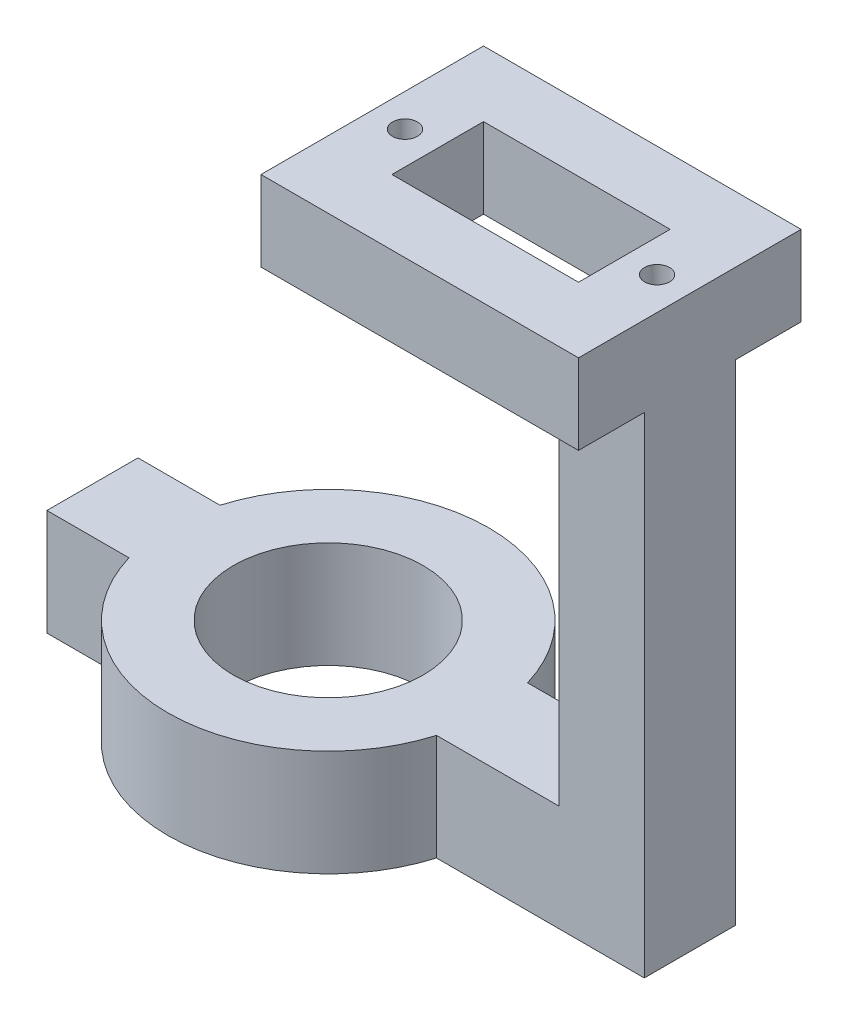
ISO-10303-21;
HEADER;
FILE_DESCRIPTION(('STEP AP214'),'2;1');
FILE_NAME('part.step','',(''),(''),'','','');
FILE_SCHEMA(('AUTOMOTIVE_DESIGN { 1 0 10303 214 1 1 1 1 }'));
ENDSEC;
DATA;
#1=APPLICATION_CONTEXT('core data for automotive mechanical design processes');
#2=APPLICATION_PROTOCOL_DEFINITION('international standard','automotive_design',2000,#1);
#3=PRODUCT_CONTEXT('',#1,'mechanical');
#4=PRODUCT('Part','Part','',(#3));
#5=PRODUCT_RELATED_PRODUCT_CATEGORY('part','',(#4));
#6=PRODUCT_DEFINITION_FORMATION('','',#4);
#7=PRODUCT_DEFINITION_CONTEXT('part definition',#1,'design');
#8=PRODUCT_DEFINITION('design','',#6,#7);
#9=PRODUCT_DEFINITION_SHAPE('','',#8);
#10=(LENGTH_UNIT() NAMED_UNIT(*) SI_UNIT(.MILLI.,.METRE.));
#11=(NAMED_UNIT(*) PLANE_ANGLE_UNIT() SI_UNIT($,.RADIAN.));
#12=(NAMED_UNIT(*) SI_UNIT($,.STERADIAN.) SOLID_ANGLE_UNIT());
#13=UNCERTAINTY_MEASURE_WITH_UNIT(LENGTH_MEASURE(1.E-05),#10,'distance_accuracy_value','');
#14=(GEOMETRIC_REPRESENTATION_CONTEXT(3) GLOBAL_UNCERTAINTY_ASSIGNED_CONTEXT((#13)) GLOBAL_UNIT_ASSIGNED_CONTEXT((#10,
#11,#12)) REPRESENTATION_CONTEXT('',''));
#15=CARTESIAN_POINT('',(0.,0.,0.));
#16=DIRECTION('',(0.,0.,1.));
#17=DIRECTION('',(1.,0.,0.));
#18=AXIS2_PLACEMENT_3D('',#15,#16,#17);
#19=CARTESIAN_POINT('',(-30.9781543438761,-58.59,0.));
#20=DIRECTION('',(0.,-1.,0.));
#21=DIRECTION('',(0.,0.,-1.));
#22=AXIS2_PLACEMENT_3D('',#19,#20,#21);
#23=CYLINDRICAL_SURFACE('',#22,24.5);
#24=DIRECTION('',(0.,-1.,0.));
#25=VECTOR('',#24,1.);
#26=CARTESIAN_POINT('',(-54.470237584832,-58.59,-6.955));
#27=LINE('',#26,#25);
#28=CARTESIAN_POINT('',(-54.470237584832,-58.59,-6.955));
#29=VERTEX_POINT('',#28);
#30=CARTESIAN_POINT('',(-54.470237584832,-74.82,-6.955));
#31=VERTEX_POINT('',#30);
#32=EDGE_CURVE('E12',#29,#31,#27,.T.);
#33=ORIENTED_EDGE('',*,*,#32,.F.);
#34=CARTESIAN_POINT('',(-30.9781543438761,-58.59,0.));
#35=DIRECTION('',(0.,-1.,0.));
#36=DIRECTION('',(1.,0.,0.));
#37=AXIS2_PLACEMENT_3D('',#34,#35,#36);
#38=CIRCLE('',#37,24.5);
#39=CARTESIAN_POINT('',(-7.48607110292026,-58.59,-6.95500000000001));
#40=VERTEX_POINT('',#39);
#41=EDGE_CURVE('E202',#29,#40,#38,.T.);
#42=ORIENTED_EDGE('',*,*,#41,.T.);
#43=DIRECTION('',(0.,-1.,0.));
#44=VECTOR('',#43,1.);
#45=CARTESIAN_POINT('',(-7.48607110292026,-58.59,-6.955));
#46=LINE('',#45,#44);
#47=CARTESIAN_POINT('',(-7.48607110292026,-74.82,-6.955));
#48=VERTEX_POINT('',#47);
#49=EDGE_CURVE('E242',#48,#40,#46,.F.);
#50=ORIENTED_EDGE('',*,*,#49,.F.);
#51=CARTESIAN_POINT('',(-30.9781543438761,-74.82,0.));
#52=DIRECTION('',(0.,-1.,0.));
#53=DIRECTION('',(1.,0.,0.));
#54=AXIS2_PLACEMENT_3D('',#51,#52,#53);
#55=CIRCLE('',#54,24.5);
#56=EDGE_CURVE('E86',#31,#48,#55,.T.);
#57=ORIENTED_EDGE('',*,*,#56,.F.);
#58=EDGE_LOOP('',(#33,#42,#50,#57));
#59=FACE_BOUND('',#58,.T.);
#60=ADVANCED_FACE('F63',(#59),#23,.T.);
#61=CARTESIAN_POINT('',(11.255,-74.82,6.955));
#62=DIRECTION('',(1.,0.,0.));
#63=DIRECTION('',(0.,0.,-1.));
#64=AXIS2_PLACEMENT_3D('',#61,#62,#63);
#65=PLANE('',#64);
#66=DIRECTION('',(0.,0.,-1.));
#67=VECTOR('',#66,1.);
#68=CARTESIAN_POINT('',(11.255,-58.59,-6.955));
#69=LINE('',#68,#67);
#70=CARTESIAN_POINT('',(11.255,-58.59,6.955));
#71=VERTEX_POINT('',#70);
#72=CARTESIAN_POINT('',(11.255,-58.59,-6.955));
#73=VERTEX_POINT('',#72);
#74=EDGE_CURVE('E245',#71,#73,#69,.T.);
#75=ORIENTED_EDGE('',*,*,#74,.F.);
#76=DIRECTION('',(0.,1.,0.));
#77=VECTOR('',#76,1.);
#78=CARTESIAN_POINT('',(11.255,-74.82,6.955));
#79=LINE('',#78,#77);
#80=CARTESIAN_POINT('',(11.255,0.,6.955));
#81=VERTEX_POINT('',#80);
#82=EDGE_CURVE('E276',#71,#81,#79,.T.);
#83=ORIENTED_EDGE('',*,*,#82,.T.);
#84=DIRECTION('',(0.,0.,-1.));
#85=VECTOR('',#84,1.);
#86=CARTESIAN_POINT('',(11.255,0.,6.955));
#87=LINE('',#86,#85);
#88=CARTESIAN_POINT('',(11.255,0.,-6.955));
#89=VERTEX_POINT('',#88);
#90=EDGE_CURVE('E266',#81,#89,#87,.T.);
#91=ORIENTED_EDGE('',*,*,#90,.T.);
#92=DIRECTION('',(0.,1.,0.));
#93=VECTOR('',#92,1.);
#94=CARTESIAN_POINT('',(11.255,-74.82,-6.955));
#95=LINE('',#94,#93);
#96=EDGE_CURVE('E274',#73,#89,#95,.T.);
#97=ORIENTED_EDGE('',*,*,#96,.F.);
#98=EDGE_LOOP('',(#75,#83,#91,#97));
#99=FACE_BOUND('',#98,.T.);
#100=ADVANCED_FACE('F379',(#99),#65,.F.);
#101=CARTESIAN_POINT('',(0.,0.,0.));
#102=DIRECTION('',(0.,1.,0.));
#103=DIRECTION('',(0.,0.,1.));
#104=AXIS2_PLACEMENT_3D('',#101,#102,#103);
#105=PLANE('',#104);
#106=CARTESIAN_POINT('',(-19.2550000000077,0.,0.));
#107=DIRECTION('',(0.,1.,0.));
#108=DIRECTION('',(0.,0.,1.));
#109=AXIS2_PLACEMENT_3D('',#106,#107,#108);
#110=CIRCLE('',#109,1.91);
#111=CARTESIAN_POINT('',(-19.2550000000077,0.,1.91));
#112=VERTEX_POINT('',#111);
#113=EDGE_CURVE('E288',#112,#112,#110,.T.);
#114=ORIENTED_EDGE('',*,*,#113,.T.);
#115=EDGE_LOOP('',(#114));
#116=FACE_BOUND('',#115,.T.);
#117=DIRECTION('',(1.,0.,0.));
#118=VECTOR('',#117,1.);
#119=CARTESIAN_POINT('',(11.255,0.,-6.955));
#120=LINE('',#119,#118);
#121=CARTESIAN_POINT('',(14.255,0.,-6.955));
#122=VERTEX_POINT('',#121);
#123=CARTESIAN_POINT('',(24.255,0.,-6.955));
#124=VERTEX_POINT('',#123);
#125=EDGE_CURVE('E271',#122,#124,#120,.T.);
#126=ORIENTED_EDGE('',*,*,#125,.F.);
#127=DIRECTION('',(0.,0.,-1.));
#128=VECTOR('',#127,1.);
#129=CARTESIAN_POINT('',(14.255,0.,-7.));
#130=LINE('',#129,#128);
#131=CARTESIAN_POINT('',(14.255,0.,-7.));
#132=VERTEX_POINT('',#131);
#133=EDGE_CURVE('E291',#122,#132,#130,.T.);
#134=ORIENTED_EDGE('',*,*,#133,.T.);
#135=DIRECTION('',(-1.,0.,0.));
#136=VECTOR('',#135,1.);
#137=CARTESIAN_POINT('',(-14.255,0.,-7.));
#138=LINE('',#137,#136);
#139=CARTESIAN_POINT('',(-14.255,0.,-7.));
#140=VERTEX_POINT('',#139);
#141=EDGE_CURVE('E307',#132,#140,#138,.T.);
#142=ORIENTED_EDGE('',*,*,#141,.T.);
#143=DIRECTION('',(0.,0.,1.));
#144=VECTOR('',#143,1.);
#145=CARTESIAN_POINT('',(-14.255,0.,-7.));
#146=LINE('',#145,#144);
#147=CARTESIAN_POINT('',(-14.255,0.,7.));
#148=VERTEX_POINT('',#147);
#149=EDGE_CURVE('E311',#140,#148,#146,.T.);
#150=ORIENTED_EDGE('',*,*,#149,.T.);
#151=DIRECTION('',(1.,0.,0.));
#152=VECTOR('',#151,1.);
#153=CARTESIAN_POINT('',(-14.255,0.,7.));
#154=LINE('',#153,#152);
#155=CARTESIAN_POINT('',(14.255,0.,7.));
#156=VERTEX_POINT('',#155);
#157=EDGE_CURVE('E297',#148,#156,#154,.T.);
#158=ORIENTED_EDGE('',*,*,#157,.T.);
#159=CARTESIAN_POINT('',(14.255,0.,6.955));
#160=VERTEX_POINT('',#159);
#161=EDGE_CURVE('E305',#156,#160,#130,.T.);
#162=ORIENTED_EDGE('',*,*,#161,.T.);
#163=DIRECTION('',(-1.,0.,0.));
#164=VECTOR('',#163,1.);
#165=CARTESIAN_POINT('',(11.255,0.,6.955));
#166=LINE('',#165,#164);
#167=CARTESIAN_POINT('',(24.255,0.,6.955));
#168=VERTEX_POINT('',#167);
#169=EDGE_CURVE('E263',#168,#160,#166,.T.);
#170=ORIENTED_EDGE('',*,*,#169,.F.);
#171=DIRECTION('',(0.,0.,-1.));
#172=VECTOR('',#171,1.);
#173=CARTESIAN_POINT('',(24.255,0.,-7.));
#174=LINE('',#173,#172);
#175=CARTESIAN_POINT('',(24.255,0.,17.));
#176=VERTEX_POINT('',#175);
#177=EDGE_CURVE('E337',#176,#168,#174,.T.);
#178=ORIENTED_EDGE('',*,*,#177,.F.);
#179=DIRECTION('',(1.,0.,0.));
#180=VECTOR('',#179,1.);
#181=CARTESIAN_POINT('',(-14.255,0.,17.));
#182=LINE('',#181,#180);
#183=CARTESIAN_POINT('',(-24.255,0.,17.));
#184=VERTEX_POINT('',#183);
#185=EDGE_CURVE('E330',#184,#176,#182,.T.);
#186=ORIENTED_EDGE('',*,*,#185,.F.);
#187=DIRECTION('',(0.,0.,1.));
#188=VECTOR('',#187,1.);
#189=CARTESIAN_POINT('',(-24.255,0.,-7.));
#190=LINE('',#189,#188);
#191=CARTESIAN_POINT('',(-24.255,0.,-17.));
#192=VERTEX_POINT('',#191);
#193=EDGE_CURVE('E342',#192,#184,#190,.T.);
#194=ORIENTED_EDGE('',*,*,#193,.F.);
#195=DIRECTION('',(-1.,0.,0.));
#196=VECTOR('',#195,1.);
#197=CARTESIAN_POINT('',(-14.255,0.,-17.));
#198=LINE('',#197,#196);
#199=CARTESIAN_POINT('',(24.255,0.,-17.));
#200=VERTEX_POINT('',#199);
#201=EDGE_CURVE('E340',#200,#192,#198,.T.);
#202=ORIENTED_EDGE('',*,*,#201,.F.);
#203=EDGE_CURVE('E325',#124,#200,#174,.T.);
#204=ORIENTED_EDGE('',*,*,#203,.F.);
#205=EDGE_LOOP('',(#126,#134,#142,#150,#158,#162,#170,#178,#186,#194,#202,#204));
#206=FACE_BOUND('',#205,.T.);
#207=ADVANCED_FACE('F390',(#116,#206),#105,.F.);
#208=CARTESIAN_POINT('',(0.,12.25,0.));
#209=DIRECTION('',(0.,1.,0.));
#210=DIRECTION('',(0.,0.,1.));
#211=AXIS2_PLACEMENT_3D('',#208,#209,#210);
#212=PLANE('',#211);
#213=CARTESIAN_POINT('',(19.2549999999935,12.25,0.));
#214=DIRECTION('',(0.,1.,0.));
#215=DIRECTION('',(0.,0.,1.));
#216=AXIS2_PLACEMENT_3D('',#213,#214,#215);
#217=CIRCLE('',#216,1.91);
#218=CARTESIAN_POINT('',(19.2549999999935,12.25,1.91));
#219=VERTEX_POINT('',#218);
#220=EDGE_CURVE('E281',#219,#219,#217,.T.);
#221=ORIENTED_EDGE('',*,*,#220,.F.);
#222=EDGE_LOOP('',(#221));
#223=FACE_BOUND('',#222,.T.);
#224=CARTESIAN_POINT('',(-19.2550000000077,12.25,0.));
#225=DIRECTION('',(0.,1.,0.));
#226=DIRECTION('',(0.,0.,1.));
#227=AXIS2_PLACEMENT_3D('',#224,#225,#226);
#228=CIRCLE('',#227,1.91);
#229=CARTESIAN_POINT('',(-19.2550000000077,12.25,1.91));
#230=VERTEX_POINT('',#229);
#231=EDGE_CURVE('E285',#230,#230,#228,.T.);
#232=ORIENTED_EDGE('',*,*,#231,.F.);
#233=EDGE_LOOP('',(#232));
#234=FACE_BOUND('',#233,.T.);
#235=DIRECTION('',(0.,0.,-1.));
#236=VECTOR('',#235,1.);
#237=CARTESIAN_POINT('',(24.255,12.25,-7.));
#238=LINE('',#237,#236);
#239=CARTESIAN_POINT('',(24.255,12.25,17.));
#240=VERTEX_POINT('',#239);
#241=CARTESIAN_POINT('',(24.255,12.25,-17.));
#242=VERTEX_POINT('',#241);
#243=EDGE_CURVE('E326',#240,#242,#238,.T.);
#244=ORIENTED_EDGE('',*,*,#243,.T.);
#245=DIRECTION('',(-1.,0.,0.));
#246=VECTOR('',#245,1.);
#247=CARTESIAN_POINT('',(-14.255,12.25,-17.));
#248=LINE('',#247,#246);
#249=CARTESIAN_POINT('',(-24.255,12.25,-17.));
#250=VERTEX_POINT('',#249);
#251=EDGE_CURVE('E329',#242,#250,#248,.T.);
#252=ORIENTED_EDGE('',*,*,#251,.T.);
#253=DIRECTION('',(0.,0.,1.));
#254=VECTOR('',#253,1.);
#255=CARTESIAN_POINT('',(-24.255,12.25,-7.));
#256=LINE('',#255,#254);
#257=CARTESIAN_POINT('',(-24.255,12.25,17.));
#258=VERTEX_POINT('',#257);
#259=EDGE_CURVE('E332',#250,#258,#256,.T.);
#260=ORIENTED_EDGE('',*,*,#259,.T.);
#261=DIRECTION('',(1.,0.,0.));
#262=VECTOR('',#261,1.);
#263=CARTESIAN_POINT('',(-14.255,12.25,17.));
#264=LINE('',#263,#262);
#265=EDGE_CURVE('E334',#258,#240,#264,.T.);
#266=ORIENTED_EDGE('',*,*,#265,.T.);
#267=EDGE_LOOP('',(#244,#252,#260,#266));
#268=FACE_BOUND('',#267,.T.);
#269=DIRECTION('',(-1.,0.,0.));
#270=VECTOR('',#269,1.);
#271=CARTESIAN_POINT('',(-14.255,12.25,-7.));
#272=LINE('',#271,#270);
#273=CARTESIAN_POINT('',(14.255,12.25,-7.));
#274=VERTEX_POINT('',#273);
#275=CARTESIAN_POINT('',(-14.255,12.25,-7.));
#276=VERTEX_POINT('',#275);
#277=EDGE_CURVE('E296',#274,#276,#272,.T.);
#278=ORIENTED_EDGE('',*,*,#277,.F.);
#279=DIRECTION('',(0.,0.,-1.));
#280=VECTOR('',#279,1.);
#281=CARTESIAN_POINT('',(14.255,12.25,-7.));
#282=LINE('',#281,#280);
#283=CARTESIAN_POINT('',(14.255,12.25,7.));
#284=VERTEX_POINT('',#283);
#285=EDGE_CURVE('E294',#284,#274,#282,.T.);
#286=ORIENTED_EDGE('',*,*,#285,.F.);
#287=DIRECTION('',(1.,0.,0.));
#288=VECTOR('',#287,1.);
#289=CARTESIAN_POINT('',(-14.255,12.25,7.));
#290=LINE('',#289,#288);
#291=CARTESIAN_POINT('',(-14.255,12.25,7.));
#292=VERTEX_POINT('',#291);
#293=EDGE_CURVE('E302',#292,#284,#290,.T.);
#294=ORIENTED_EDGE('',*,*,#293,.F.);
#295=DIRECTION('',(0.,0.,1.));
#296=VECTOR('',#295,1.);
#297=CARTESIAN_POINT('',(-14.255,12.25,-7.));
#298=LINE('',#297,#296);
#299=EDGE_CURVE('E299',#276,#292,#298,.T.);
#300=ORIENTED_EDGE('',*,*,#299,.F.);
#301=EDGE_LOOP('',(#278,#286,#294,#300));
#302=FACE_BOUND('',#301,.T.);
#303=ADVANCED_FACE('F402',(#223,#234,#268,#302),#212,.T.);
#304=CARTESIAN_POINT('',(24.255,12.25,-7.));
#305=DIRECTION('',(-1.,0.,0.));
#306=DIRECTION('',(0.,0.,1.));
#307=AXIS2_PLACEMENT_3D('',#304,#305,#306);
#308=PLANE('',#307);
#309=ORIENTED_EDGE('',*,*,#177,.T.);
#310=DIRECTION('',(0.,1.,0.));
#311=VECTOR('',#310,1.);
#312=CARTESIAN_POINT('',(24.255,-74.82,6.955));
#313=LINE('',#312,#311);
#314=CARTESIAN_POINT('',(24.255,-74.82,6.955));
#315=VERTEX_POINT('',#314);
#316=EDGE_CURVE('E278',#315,#168,#313,.T.);
#317=ORIENTED_EDGE('',*,*,#316,.F.);
#318=DIRECTION('',(0.,0.,1.));
#319=VECTOR('',#318,1.);
#320=CARTESIAN_POINT('',(24.255,-74.82,6.955));
#321=LINE('',#320,#319);
#322=CARTESIAN_POINT('',(24.255,-74.82,-6.955));
#323=VERTEX_POINT('',#322);
#324=EDGE_CURVE('E253',#323,#315,#321,.T.);
#325=ORIENTED_EDGE('',*,*,#324,.F.);
#326=DIRECTION('',(0.,1.,0.));
#327=VECTOR('',#326,1.);
#328=CARTESIAN_POINT('',(24.255,-74.82,-6.955));
#329=LINE('',#328,#327);
#330=EDGE_CURVE('E262',#323,#124,#329,.T.);
#331=ORIENTED_EDGE('',*,*,#330,.T.);
#332=ORIENTED_EDGE('',*,*,#203,.T.);
#333=DIRECTION('',(0.,-1.,0.));
#334=VECTOR('',#333,1.);
#335=CARTESIAN_POINT('',(24.255,12.25,-17.));
#336=LINE('',#335,#334);
#337=EDGE_CURVE('E353',#242,#200,#336,.T.);
#338=ORIENTED_EDGE('',*,*,#337,.F.);
#339=ORIENTED_EDGE('',*,*,#243,.F.);
#340=DIRECTION('',(0.,-1.,0.));
#341=VECTOR('',#340,1.);
#342=CARTESIAN_POINT('',(24.255,12.25,17.));
#343=LINE('',#342,#341);
#344=EDGE_CURVE('E336',#240,#176,#343,.T.);
#345=ORIENTED_EDGE('',*,*,#344,.T.);
#346=EDGE_LOOP('',(#309,#317,#325,#331,#332,#338,#339,#345));
#347=FACE_BOUND('',#346,.T.);
#348=ADVANCED_FACE('F65',(#347),#308,.F.);
#349=CARTESIAN_POINT('',(-14.255,12.25,-17.));
#350=DIRECTION('',(0.,0.,1.));
#351=DIRECTION('',(1.,0.,0.));
#352=AXIS2_PLACEMENT_3D('',#349,#350,#351);
#353=PLANE('',#352);
#354=ORIENTED_EDGE('',*,*,#201,.T.);
#355=DIRECTION('',(0.,-1.,0.));
#356=VECTOR('',#355,1.);
#357=CARTESIAN_POINT('',(-24.255,12.25,-17.));
#358=LINE('',#357,#356);
#359=EDGE_CURVE('E350',#250,#192,#358,.T.);
#360=ORIENTED_EDGE('',*,*,#359,.F.);
#361=ORIENTED_EDGE('',*,*,#251,.F.);
#362=ORIENTED_EDGE('',*,*,#337,.T.);
#363=EDGE_LOOP('',(#354,#360,#361,#362));
#364=FACE_BOUND('',#363,.T.);
#365=ADVANCED_FACE('F467',(#364),#353,.F.);
#366=CARTESIAN_POINT('',(-24.255,12.25,-7.));
#367=DIRECTION('',(1.,0.,0.));
#368=DIRECTION('',(0.,0.,-1.));
#369=AXIS2_PLACEMENT_3D('',#366,#367,#368);
#370=PLANE('',#369);
#371=ORIENTED_EDGE('',*,*,#193,.T.);
#372=DIRECTION('',(0.,-1.,0.));
#373=VECTOR('',#372,1.);
#374=CARTESIAN_POINT('',(-24.255,12.25,17.));
#375=LINE('',#374,#373);
#376=EDGE_CURVE('E347',#258,#184,#375,.T.);
#377=ORIENTED_EDGE('',*,*,#376,.F.);
#378=ORIENTED_EDGE('',*,*,#259,.F.);
#379=ORIENTED_EDGE('',*,*,#359,.T.);
#380=EDGE_LOOP('',(#371,#377,#378,#379));
#381=FACE_BOUND('',#380,.T.);
#382=ADVANCED_FACE('F472',(#381),#370,.F.);
#383=CARTESIAN_POINT('',(-14.255,12.25,17.));
#384=DIRECTION('',(0.,0.,-1.));
#385=DIRECTION('',(-1.,0.,0.));
#386=AXIS2_PLACEMENT_3D('',#383,#384,#385);
#387=PLANE('',#386);
#388=ORIENTED_EDGE('',*,*,#185,.T.);
#389=ORIENTED_EDGE('',*,*,#344,.F.);
#390=ORIENTED_EDGE('',*,*,#265,.F.);
#391=ORIENTED_EDGE('',*,*,#376,.T.);
#392=EDGE_LOOP('',(#388,#389,#390,#391));
#393=FACE_BOUND('',#392,.T.);
#394=ADVANCED_FACE('F475',(#393),#387,.F.);
#395=CARTESIAN_POINT('',(14.255,12.25,-7.));
#396=DIRECTION('',(-1.,0.,0.));
#397=DIRECTION('',(0.,0.,1.));
#398=AXIS2_PLACEMENT_3D('',#395,#396,#397);
#399=PLANE('',#398);
#400=ORIENTED_EDGE('',*,*,#161,.F.);
#401=DIRECTION('',(0.,-1.,0.));
#402=VECTOR('',#401,1.);
#403=CARTESIAN_POINT('',(14.255,12.25,7.));
#404=LINE('',#403,#402);
#405=EDGE_CURVE('E304',#284,#156,#404,.T.);
#406=ORIENTED_EDGE('',*,*,#405,.F.);
#407=ORIENTED_EDGE('',*,*,#285,.T.);
#408=DIRECTION('',(0.,-1.,0.));
#409=VECTOR('',#408,1.);
#410=CARTESIAN_POINT('',(14.255,12.25,-7.));
#411=LINE('',#410,#409);
#412=EDGE_CURVE('E322',#274,#132,#411,.T.);
#413=ORIENTED_EDGE('',*,*,#412,.T.);
#414=ORIENTED_EDGE('',*,*,#133,.F.);
#415=EDGE_CURVE('E308',#160,#122,#130,.T.);
#416=ORIENTED_EDGE('',*,*,#415,.F.);
#417=EDGE_LOOP('',(#400,#406,#407,#413,#414,#416));
#418=FACE_BOUND('',#417,.T.);
#419=ADVANCED_FACE('F397',(#418),#399,.T.);
#420=CARTESIAN_POINT('',(-14.255,12.25,-7.));
#421=DIRECTION('',(0.,0.,1.));
#422=DIRECTION('',(1.,0.,0.));
#423=AXIS2_PLACEMENT_3D('',#420,#421,#422);
#424=PLANE('',#423);
#425=ORIENTED_EDGE('',*,*,#141,.F.);
#426=ORIENTED_EDGE('',*,*,#412,.F.);
#427=ORIENTED_EDGE('',*,*,#277,.T.);
#428=DIRECTION('',(0.,-1.,0.));
#429=VECTOR('',#428,1.);
#430=CARTESIAN_POINT('',(-14.255,12.25,-7.));
#431=LINE('',#430,#429);
#432=EDGE_CURVE('E320',#276,#140,#431,.T.);
#433=ORIENTED_EDGE('',*,*,#432,.T.);
#434=EDGE_LOOP('',(#425,#426,#427,#433));
#435=FACE_BOUND('',#434,.T.);
#436=ADVANCED_FACE('F393',(#435),#424,.T.);
#437=CARTESIAN_POINT('',(-14.255,12.25,-7.));
#438=DIRECTION('',(1.,0.,0.));
#439=DIRECTION('',(0.,0.,-1.));
#440=AXIS2_PLACEMENT_3D('',#437,#438,#439);
#441=PLANE('',#440);
#442=ORIENTED_EDGE('',*,*,#149,.F.);
#443=ORIENTED_EDGE('',*,*,#432,.F.);
#444=ORIENTED_EDGE('',*,*,#299,.T.);
#445=DIRECTION('',(0.,-1.,0.));
#446=VECTOR('',#445,1.);
#447=CARTESIAN_POINT('',(-14.255,12.25,7.));
#448=LINE('',#447,#446);
#449=EDGE_CURVE('E318',#292,#148,#448,.T.);
#450=ORIENTED_EDGE('',*,*,#449,.T.);
#451=EDGE_LOOP('',(#442,#443,#444,#450));
#452=FACE_BOUND('',#451,.T.);
#453=ADVANCED_FACE('F405',(#452),#441,.T.);
#454=CARTESIAN_POINT('',(-14.255,12.25,7.));
#455=DIRECTION('',(0.,0.,-1.));
#456=DIRECTION('',(-1.,0.,0.));
#457=AXIS2_PLACEMENT_3D('',#454,#455,#456);
#458=PLANE('',#457);
#459=ORIENTED_EDGE('',*,*,#157,.F.);
#460=ORIENTED_EDGE('',*,*,#449,.F.);
#461=ORIENTED_EDGE('',*,*,#293,.T.);
#462=ORIENTED_EDGE('',*,*,#405,.T.);
#463=EDGE_LOOP('',(#459,#460,#461,#462));
#464=FACE_BOUND('',#463,.T.);
#465=ADVANCED_FACE('F408',(#464),#458,.T.);
#466=CARTESIAN_POINT('',(-19.2550000000077,0.,0.));
#467=DIRECTION('',(0.,1.,0.));
#468=DIRECTION('',(0.,0.,1.));
#469=AXIS2_PLACEMENT_3D('',#466,#467,#468);
#470=CYLINDRICAL_SURFACE('',#469,1.91);
#471=ORIENTED_EDGE('',*,*,#113,.F.);
#472=EDGE_LOOP('',(#471));
#473=FACE_BOUND('',#472,.T.);
#474=ORIENTED_EDGE('',*,*,#231,.T.);
#475=EDGE_LOOP('',(#474));
#476=FACE_BOUND('',#475,.T.);
#477=ADVANCED_FACE('F410',(#473,#476),#470,.F.);
#478=CARTESIAN_POINT('',(19.2549999999935,0.,0.));
#479=DIRECTION('',(0.,1.,0.));
#480=DIRECTION('',(0.,0.,1.));
#481=AXIS2_PLACEMENT_3D('',#478,#479,#480);
#482=CYLINDRICAL_SURFACE('',#481,1.91);
#483=CARTESIAN_POINT('',(19.2549999999935,0.,0.));
#484=DIRECTION('',(0.,1.,0.));
#485=DIRECTION('',(0.,0.,1.));
#486=AXIS2_PLACEMENT_3D('',#483,#484,#485);
#487=CIRCLE('',#486,1.91);
#488=CARTESIAN_POINT('',(19.2549999999935,0.,1.91));
#489=VERTEX_POINT('',#488);
#490=EDGE_CURVE('E282',#489,#489,#487,.T.);
#491=ORIENTED_EDGE('',*,*,#490,.F.);
#492=EDGE_LOOP('',(#491));
#493=FACE_BOUND('',#492,.T.);
#494=ORIENTED_EDGE('',*,*,#220,.T.);
#495=EDGE_LOOP('',(#494));
#496=FACE_BOUND('',#495,.T.);
#497=ADVANCED_FACE('F416',(#493,#496),#482,.F.);
#498=CARTESIAN_POINT('',(0.,-74.82,0.));
#499=DIRECTION('',(0.,-1.,0.));
#500=DIRECTION('',(0.,0.,-1.));
#501=AXIS2_PLACEMENT_3D('',#498,#499,#500);
#502=PLANE('',#501);
#503=CARTESIAN_POINT('',(-7.48607110292025,-74.82,6.955));
#504=VERTEX_POINT('',#503);
#505=CARTESIAN_POINT('',(-54.470237584832,-74.82,6.955));
#506=VERTEX_POINT('',#505);
#507=EDGE_CURVE('E238',#504,#506,#55,.T.);
#508=ORIENTED_EDGE('',*,*,#507,.T.);
#509=DIRECTION('',(1.,0.,0.));
#510=VECTOR('',#509,1.);
#511=CARTESIAN_POINT('',(-67.,-74.82,6.955));
#512=LINE('',#511,#510);
#513=CARTESIAN_POINT('',(-67.,-74.82,6.955));
#514=VERTEX_POINT('',#513);
#515=EDGE_CURVE('E227',#514,#506,#512,.T.);
#516=ORIENTED_EDGE('',*,*,#515,.F.);
#517=DIRECTION('',(0.,0.,-1.));
#518=VECTOR('',#517,1.);
#519=CARTESIAN_POINT('',(-67.,-74.82,-6.955));
#520=LINE('',#519,#518);
#521=CARTESIAN_POINT('',(-67.,-74.82,-6.955));
#522=VERTEX_POINT('',#521);
#523=EDGE_CURVE('E206',#514,#522,#520,.T.);
#524=ORIENTED_EDGE('',*,*,#523,.T.);
#525=DIRECTION('',(1.,0.,0.));
#526=VECTOR('',#525,1.);
#527=CARTESIAN_POINT('',(-67.,-74.82,-6.955));
#528=LINE('',#527,#526);
#529=EDGE_CURVE('E220',#522,#31,#528,.T.);
#530=ORIENTED_EDGE('',*,*,#529,.T.);
#531=ORIENTED_EDGE('',*,*,#56,.T.);
#532=DIRECTION('',(1.,0.,0.));
#533=VECTOR('',#532,1.);
#534=CARTESIAN_POINT('',(11.255,-74.82,-6.955));
#535=LINE('',#534,#533);
#536=EDGE_CURVE('E260',#48,#323,#535,.T.);
#537=ORIENTED_EDGE('',*,*,#536,.T.);
#538=ORIENTED_EDGE('',*,*,#324,.T.);
#539=DIRECTION('',(-1.,0.,0.));
#540=VECTOR('',#539,1.);
#541=CARTESIAN_POINT('',(11.255,-74.82,6.955));
#542=LINE('',#541,#540);
#543=EDGE_CURVE('E256',#315,#504,#542,.T.);
#544=ORIENTED_EDGE('',*,*,#543,.T.);
#545=EDGE_LOOP('',(#508,#516,#524,#530,#531,#537,#538,#544));
#546=FACE_BOUND('',#545,.T.);
#547=CARTESIAN_POINT('',(-30.9781543438761,-74.82,0.));
#548=DIRECTION('',(0.,-1.,0.));
#549=DIRECTION('',(0.,0.,-1.));
#550=AXIS2_PLACEMENT_3D('',#547,#548,#549);
#551=CIRCLE('',#550,14.5);
#552=CARTESIAN_POINT('',(-30.9781543438761,-74.82,-14.5));
#553=VERTEX_POINT('',#552);
#554=EDGE_CURVE('E226',#553,#553,#551,.T.);
#555=ORIENTED_EDGE('',*,*,#554,.F.);
#556=EDGE_LOOP('',(#555));
#557=FACE_BOUND('',#556,.T.);
#558=ADVANCED_FACE('F370',(#546,#557),#502,.T.);
#559=CARTESIAN_POINT('',(11.255,-74.82,-6.955));
#560=DIRECTION('',(0.,0.,1.));
#561=DIRECTION('',(1.,0.,0.));
#562=AXIS2_PLACEMENT_3D('',#559,#560,#561);
#563=PLANE('',#562);
#564=ORIENTED_EDGE('',*,*,#536,.F.);
#565=ORIENTED_EDGE('',*,*,#49,.T.);
#566=DIRECTION('',(1.,0.,0.));
#567=VECTOR('',#566,1.);
#568=CARTESIAN_POINT('',(-12.315,-58.59,-6.95500000000001));
#569=LINE('',#568,#567);
#570=EDGE_CURVE('E248',#40,#73,#569,.T.);
#571=ORIENTED_EDGE('',*,*,#570,.T.);
#572=ORIENTED_EDGE('',*,*,#96,.T.);
#573=EDGE_CURVE('E257',#89,#122,#120,.T.);
#574=ORIENTED_EDGE('',*,*,#573,.T.);
#575=ORIENTED_EDGE('',*,*,#125,.T.);
#576=ORIENTED_EDGE('',*,*,#330,.F.);
#577=EDGE_LOOP('',(#564,#565,#571,#572,#574,#575,#576));
#578=FACE_BOUND('',#577,.T.);
#579=ADVANCED_FACE('F360',(#578),#563,.F.);
#580=CARTESIAN_POINT('',(11.255,-74.82,6.955));
#581=DIRECTION('',(0.,0.,-1.));
#582=DIRECTION('',(-1.,0.,0.));
#583=AXIS2_PLACEMENT_3D('',#580,#581,#582);
#584=PLANE('',#583);
#585=DIRECTION('',(1.,0.,0.));
#586=VECTOR('',#585,1.);
#587=CARTESIAN_POINT('',(-12.315,-58.59,6.95499999999999));
#588=LINE('',#587,#586);
#589=CARTESIAN_POINT('',(-7.48607110292026,-58.59,6.95499999999999));
#590=VERTEX_POINT('',#589);
#591=EDGE_CURVE('E250',#590,#71,#588,.T.);
#592=ORIENTED_EDGE('',*,*,#591,.F.);
#593=DIRECTION('',(0.,-1.,0.));
#594=VECTOR('',#593,1.);
#595=CARTESIAN_POINT('',(-7.48607110292026,-58.59,6.955));
#596=LINE('',#595,#594);
#597=EDGE_CURVE('E237',#590,#504,#596,.T.);
#598=ORIENTED_EDGE('',*,*,#597,.T.);
#599=ORIENTED_EDGE('',*,*,#543,.F.);
#600=ORIENTED_EDGE('',*,*,#316,.T.);
#601=ORIENTED_EDGE('',*,*,#169,.T.);
#602=EDGE_CURVE('E252',#160,#81,#166,.T.);
#603=ORIENTED_EDGE('',*,*,#602,.T.);
#604=ORIENTED_EDGE('',*,*,#82,.F.);
#605=EDGE_LOOP('',(#592,#598,#599,#600,#601,#603,#604));
#606=FACE_BOUND('',#605,.T.);
#607=ADVANCED_FACE('F381',(#606),#584,.F.);
#608=CARTESIAN_POINT('',(0.,0.,0.));
#609=DIRECTION('',(0.,-1.,0.));
#610=DIRECTION('',(0.,0.,-1.));
#611=AXIS2_PLACEMENT_3D('',#608,#609,#610);
#612=PLANE('',#611);
#613=ORIENTED_EDGE('',*,*,#602,.F.);
#614=ORIENTED_EDGE('',*,*,#415,.T.);
#615=ORIENTED_EDGE('',*,*,#573,.F.);
#616=ORIENTED_EDGE('',*,*,#90,.F.);
#617=EDGE_LOOP('',(#613,#614,#615,#616));
#618=FACE_BOUND('',#617,.T.);
#619=ADVANCED_FACE('F386',(#618),#612,.F.);
#620=ORIENTED_EDGE('',*,*,#490,.T.);
#621=EDGE_LOOP('',(#620));
#622=FACE_BOUND('',#621,.T.);
#623=ADVANCED_FACE('F436',(#622),#612,.F.);
#624=CARTESIAN_POINT('',(-12.315,-58.59,-6.95500000000001));
#625=DIRECTION('',(0.,-1.,0.));
#626=DIRECTION('',(0.,0.,-1.));
#627=AXIS2_PLACEMENT_3D('',#624,#625,#626);
#628=PLANE('',#627);
#629=DIRECTION('',(1.,0.,0.));
#630=VECTOR('',#629,1.);
#631=CARTESIAN_POINT('',(-67.,-58.59,6.955));
#632=LINE('',#631,#630);
#633=CARTESIAN_POINT('',(-67.,-58.59,6.955));
#634=VERTEX_POINT('',#633);
#635=CARTESIAN_POINT('',(-54.470237584832,-58.59,6.955));
#636=VERTEX_POINT('',#635);
#637=EDGE_CURVE('E205',#634,#636,#632,.T.);
#638=ORIENTED_EDGE('',*,*,#637,.T.);
#639=EDGE_CURVE('E78',#590,#636,#38,.T.);
#640=ORIENTED_EDGE('',*,*,#639,.F.);
#641=ORIENTED_EDGE('',*,*,#591,.T.);
#642=ORIENTED_EDGE('',*,*,#74,.T.);
#643=ORIENTED_EDGE('',*,*,#570,.F.);
#644=ORIENTED_EDGE('',*,*,#41,.F.);
#645=DIRECTION('',(1.,0.,0.));
#646=VECTOR('',#645,1.);
#647=CARTESIAN_POINT('',(-67.,-58.59,-6.955));
#648=LINE('',#647,#646);
#649=CARTESIAN_POINT('',(-67.,-58.59,-6.955));
#650=VERTEX_POINT('',#649);
#651=EDGE_CURVE('E195',#650,#29,#648,.T.);
#652=ORIENTED_EDGE('',*,*,#651,.F.);
#653=DIRECTION('',(0.,0.,1.));
#654=VECTOR('',#653,1.);
#655=CARTESIAN_POINT('',(-67.,-58.59,-6.955));
#656=LINE('',#655,#654);
#657=EDGE_CURVE('E200',#650,#634,#656,.T.);
#658=ORIENTED_EDGE('',*,*,#657,.T.);
#659=EDGE_LOOP('',(#638,#640,#641,#642,#643,#644,#652,#658));
#660=FACE_BOUND('',#659,.T.);
#661=CARTESIAN_POINT('',(-30.9781543438761,-58.59,0.));
#662=DIRECTION('',(0.,-1.,0.));
#663=DIRECTION('',(0.,0.,-1.));
#664=AXIS2_PLACEMENT_3D('',#661,#662,#663);
#665=CIRCLE('',#664,14.5);
#666=CARTESIAN_POINT('',(-30.9781543438761,-58.59,-14.5));
#667=VERTEX_POINT('',#666);
#668=EDGE_CURVE('E231',#667,#667,#665,.T.);
#669=ORIENTED_EDGE('',*,*,#668,.T.);
#670=EDGE_LOOP('',(#669));
#671=FACE_BOUND('',#670,.T.);
#672=ADVANCED_FACE('F198',(#660,#671),#628,.F.);
#673=DIRECTION('',(0.,-1.,0.));
#674=VECTOR('',#673,1.);
#675=CARTESIAN_POINT('',(-54.470237584832,-58.59,6.955));
#676=LINE('',#675,#674);
#677=EDGE_CURVE('E71',#506,#636,#676,.F.);
#678=ORIENTED_EDGE('',*,*,#677,.F.);
#679=ORIENTED_EDGE('',*,*,#507,.F.);
#680=ORIENTED_EDGE('',*,*,#597,.F.);
#681=ORIENTED_EDGE('',*,*,#639,.T.);
#682=EDGE_LOOP('',(#678,#679,#680,#681));
#683=FACE_BOUND('',#682,.T.);
#684=ADVANCED_FACE('F422',(#683),#23,.T.);
#685=CARTESIAN_POINT('',(-30.9781543438761,-58.59,0.));
#686=DIRECTION('',(0.,-1.,0.));
#687=DIRECTION('',(0.,0.,-1.));
#688=AXIS2_PLACEMENT_3D('',#685,#686,#687);
#689=CYLINDRICAL_SURFACE('',#688,14.5);
#690=ORIENTED_EDGE('',*,*,#668,.F.);
#691=EDGE_LOOP('',(#690));
#692=FACE_BOUND('',#691,.T.);
#693=ORIENTED_EDGE('',*,*,#554,.T.);
#694=EDGE_LOOP('',(#693));
#695=FACE_BOUND('',#694,.T.);
#696=ADVANCED_FACE('F430',(#692,#695),#689,.F.);
#697=CARTESIAN_POINT('',(-67.,-58.59,-6.955));
#698=DIRECTION('',(0.,0.,-1.));
#699=DIRECTION('',(-1.,0.,0.));
#700=AXIS2_PLACEMENT_3D('',#697,#698,#699);
#701=PLANE('',#700);
#702=ORIENTED_EDGE('',*,*,#651,.T.);
#703=ORIENTED_EDGE('',*,*,#32,.T.);
#704=ORIENTED_EDGE('',*,*,#529,.F.);
#705=DIRECTION('',(0.,1.,0.));
#706=VECTOR('',#705,1.);
#707=CARTESIAN_POINT('',(-67.,-58.59,-6.955));
#708=LINE('',#707,#706);
#709=EDGE_CURVE('E213',#522,#650,#708,.T.);
#710=ORIENTED_EDGE('',*,*,#709,.T.);
#711=EDGE_LOOP('',(#702,#703,#704,#710));
#712=FACE_BOUND('',#711,.T.);
#713=ADVANCED_FACE('F218',(#712),#701,.T.);
#714=CARTESIAN_POINT('',(-67.,-58.59,6.955));
#715=DIRECTION('',(0.,0.,1.));
#716=DIRECTION('',(1.,0.,0.));
#717=AXIS2_PLACEMENT_3D('',#714,#715,#716);
#718=PLANE('',#717);
#719=ORIENTED_EDGE('',*,*,#515,.T.);
#720=ORIENTED_EDGE('',*,*,#677,.T.);
#721=ORIENTED_EDGE('',*,*,#637,.F.);
#722=DIRECTION('',(0.,-1.,0.));
#723=VECTOR('',#722,1.);
#724=CARTESIAN_POINT('',(-67.,-58.59,6.955));
#725=LINE('',#724,#723);
#726=EDGE_CURVE('E216',#634,#514,#725,.T.);
#727=ORIENTED_EDGE('',*,*,#726,.T.);
#728=EDGE_LOOP('',(#719,#720,#721,#727));
#729=FACE_BOUND('',#728,.T.);
#730=ADVANCED_FACE('F373',(#729),#718,.T.);
#731=CARTESIAN_POINT('',(-67.,0.,0.));
#732=DIRECTION('',(-1.,0.,0.));
#733=DIRECTION('',(0.,0.,1.));
#734=AXIS2_PLACEMENT_3D('',#731,#732,#733);
#735=PLANE('',#734);
#736=ORIENTED_EDGE('',*,*,#709,.F.);
#737=ORIENTED_EDGE('',*,*,#523,.F.);
#738=ORIENTED_EDGE('',*,*,#726,.F.);
#739=ORIENTED_EDGE('',*,*,#657,.F.);
#740=EDGE_LOOP('',(#736,#737,#738,#739));
#741=FACE_BOUND('',#740,.T.);
#742=ADVANCED_FACE('F211',(#741),#735,.T.);
#743=CLOSED_SHELL('',(#60,#100,#207,#303,#348,#365,#382,#394,#419,#436,#453,#465,#477,#497,#558,
#579,#607,#619,#623,#672,#684,#696,#713,#730,#742));
#744=MANIFOLD_SOLID_BREP('B2',#743);
#745=ADVANCED_BREP_SHAPE_REPRESENTATION('',(#18,#744),#14);
#746=SHAPE_DEFINITION_REPRESENTATION(#9,#745);
ENDSEC;
END-ISO-10303-21;
